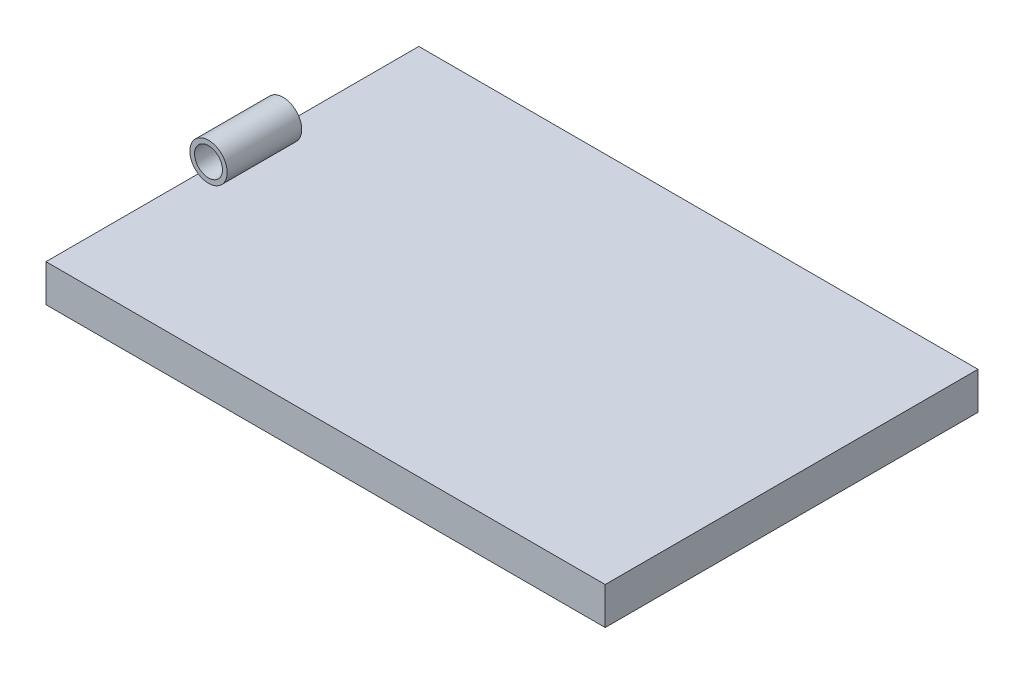
ISO-10303-21;
HEADER;
FILE_DESCRIPTION(('STEP AP214'),'2;1');
FILE_NAME('part.step','',(''),(''),'','','');
FILE_SCHEMA(('AUTOMOTIVE_DESIGN { 1 0 10303 214 1 1 1 1 }'));
ENDSEC;
DATA;
#1=APPLICATION_CONTEXT('core data for automotive mechanical design processes');
#2=APPLICATION_PROTOCOL_DEFINITION('international standard','automotive_design',2000,#1);
#3=PRODUCT_CONTEXT('',#1,'mechanical');
#4=PRODUCT('Part','Part','',(#3));
#5=PRODUCT_RELATED_PRODUCT_CATEGORY('part','',(#4));
#6=PRODUCT_DEFINITION_FORMATION('','',#4);
#7=PRODUCT_DEFINITION_CONTEXT('part definition',#1,'design');
#8=PRODUCT_DEFINITION('design','',#6,#7);
#9=PRODUCT_DEFINITION_SHAPE('','',#8);
#10=(LENGTH_UNIT() NAMED_UNIT(*) SI_UNIT(.MILLI.,.METRE.));
#11=(NAMED_UNIT(*) PLANE_ANGLE_UNIT() SI_UNIT($,.RADIAN.));
#12=(NAMED_UNIT(*) SI_UNIT($,.STERADIAN.) SOLID_ANGLE_UNIT());
#13=UNCERTAINTY_MEASURE_WITH_UNIT(LENGTH_MEASURE(1.E-05),#10,'distance_accuracy_value','');
#14=(GEOMETRIC_REPRESENTATION_CONTEXT(3) GLOBAL_UNCERTAINTY_ASSIGNED_CONTEXT((#13)) GLOBAL_UNIT_ASSIGNED_CONTEXT((#10,
#11,#12)) REPRESENTATION_CONTEXT('',''));
#15=CARTESIAN_POINT('',(0.,0.,0.));
#16=DIRECTION('',(0.,0.,1.));
#17=DIRECTION('',(1.,0.,0.));
#18=AXIS2_PLACEMENT_3D('',#15,#16,#17);
#19=CARTESIAN_POINT('',(1.82538706777381,7.62,-30.48));
#20=DIRECTION('',(0.,0.,1.));
#21=DIRECTION('',(1.,0.,0.));
#22=AXIS2_PLACEMENT_3D('',#19,#20,#21);
#23=CYLINDRICAL_SURFACE('',#22,2.54);
#24=CARTESIAN_POINT('',(1.82538706777381,7.62,-30.48));
#25=DIRECTION('',(0.,0.,1.));
#26=DIRECTION('',(1.,0.,0.));
#27=AXIS2_PLACEMENT_3D('',#24,#25,#26);
#28=CIRCLE('',#27,2.54);
#29=CARTESIAN_POINT('',(4.36538706777381,7.62,-30.48));
#30=VERTEX_POINT('',#29);
#31=EDGE_CURVE('E12',#30,#30,#28,.T.);
#32=ORIENTED_EDGE('',*,*,#31,.T.);
#33=EDGE_LOOP('',(#32));
#34=FACE_BOUND('',#33,.T.);
#35=CARTESIAN_POINT('',(1.82538706777381,7.62,-20.32));
#36=DIRECTION('',(0.,0.,1.));
#37=DIRECTION('',(1.,0.,0.));
#38=AXIS2_PLACEMENT_3D('',#35,#36,#37);
#39=CIRCLE('',#38,2.54);
#40=CARTESIAN_POINT('',(4.36538706777381,7.62,-20.32));
#41=VERTEX_POINT('',#40);
#42=EDGE_CURVE('E63',#41,#41,#39,.T.);
#43=ORIENTED_EDGE('',*,*,#42,.F.);
#44=EDGE_LOOP('',(#43));
#45=FACE_BOUND('',#44,.T.);
#46=ADVANCED_FACE('F53',(#34,#45),#23,.T.);
#47=CARTESIAN_POINT('',(1.82538706777381,7.62,-30.48));
#48=DIRECTION('',(0.,0.,1.));
#49=DIRECTION('',(1.,0.,0.));
#50=AXIS2_PLACEMENT_3D('',#47,#48,#49);
#51=PLANE('',#50);
#52=CARTESIAN_POINT('',(1.82538706777381,7.62,-30.48));
#53=DIRECTION('',(0.,0.,1.));
#54=DIRECTION('',(1.,0.,0.));
#55=AXIS2_PLACEMENT_3D('',#52,#53,#54);
#56=CIRCLE('',#55,1.905);
#57=CARTESIAN_POINT('',(3.7303870677738,7.62,-30.48));
#58=VERTEX_POINT('',#57);
#59=EDGE_CURVE('E59',#58,#58,#56,.T.);
#60=ORIENTED_EDGE('',*,*,#59,.T.);
#61=EDGE_LOOP('',(#60));
#62=FACE_BOUND('',#61,.T.);
#63=ORIENTED_EDGE('',*,*,#31,.F.);
#64=EDGE_LOOP('',(#63));
#65=FACE_BOUND('',#64,.T.);
#66=ADVANCED_FACE('F82',(#62,#65),#51,.F.);
#67=CARTESIAN_POINT('',(1.82538706777381,7.62,-30.48));
#68=DIRECTION('',(0.,0.,1.));
#69=DIRECTION('',(1.,0.,0.));
#70=AXIS2_PLACEMENT_3D('',#67,#68,#69);
#71=CYLINDRICAL_SURFACE('',#70,1.905);
#72=ORIENTED_EDGE('',*,*,#59,.F.);
#73=EDGE_LOOP('',(#72));
#74=FACE_BOUND('',#73,.T.);
#75=CARTESIAN_POINT('',(1.82538706777381,7.62,-20.32));
#76=DIRECTION('',(0.,0.,1.));
#77=DIRECTION('',(1.,0.,0.));
#78=AXIS2_PLACEMENT_3D('',#75,#76,#77);
#79=CIRCLE('',#78,1.905);
#80=CARTESIAN_POINT('',(3.7303870677738,7.62,-20.32));
#81=VERTEX_POINT('',#80);
#82=EDGE_CURVE('E67',#81,#81,#79,.T.);
#83=ORIENTED_EDGE('',*,*,#82,.T.);
#84=EDGE_LOOP('',(#83));
#85=FACE_BOUND('',#84,.T.);
#86=ADVANCED_FACE('F73',(#74,#85),#71,.F.);
#87=CARTESIAN_POINT('',(1.82538706777381,7.62,-20.32));
#88=DIRECTION('',(0.,0.,1.));
#89=DIRECTION('',(1.,0.,0.));
#90=AXIS2_PLACEMENT_3D('',#87,#88,#89);
#91=PLANE('',#90);
#92=ORIENTED_EDGE('',*,*,#42,.T.);
#93=EDGE_LOOP('',(#92));
#94=FACE_BOUND('',#93,.T.);
#95=ORIENTED_EDGE('',*,*,#82,.F.);
#96=EDGE_LOOP('',(#95));
#97=FACE_BOUND('',#96,.T.);
#98=ADVANCED_FACE('F75',(#94,#97),#91,.T.);
#99=CLOSED_SHELL('',(#46,#66,#86,#98));
#100=MANIFOLD_SOLID_BREP('B2',#99);
#101=CARTESIAN_POINT('',(0.,5.08,0.));
#102=DIRECTION('',(1.,0.,0.));
#103=DIRECTION('',(0.,0.,-1.));
#104=AXIS2_PLACEMENT_3D('',#101,#102,#103);
#105=PLANE('',#104);
#106=DIRECTION('',(0.,0.,1.));
#107=VECTOR('',#106,1.);
#108=CARTESIAN_POINT('',(0.,0.,0.));
#109=LINE('',#108,#107);
#110=CARTESIAN_POINT('',(0.,0.,-50.8));
#111=VERTEX_POINT('',#110);
#112=CARTESIAN_POINT('',(0.,0.,0.));
#113=VERTEX_POINT('',#112);
#114=EDGE_CURVE('E177',#111,#113,#109,.T.);
#115=ORIENTED_EDGE('',*,*,#114,.T.);
#116=DIRECTION('',(0.,-1.,0.));
#117=VECTOR('',#116,1.);
#118=CARTESIAN_POINT('',(0.,5.08,0.));
#119=LINE('',#118,#117);
#120=CARTESIAN_POINT('',(0.,5.08,0.));
#121=VERTEX_POINT('',#120);
#122=EDGE_CURVE('E51',#121,#113,#119,.T.);
#123=ORIENTED_EDGE('',*,*,#122,.F.);
#124=DIRECTION('',(0.,0.,1.));
#125=VECTOR('',#124,1.);
#126=CARTESIAN_POINT('',(0.,5.08,0.));
#127=LINE('',#126,#125);
#128=CARTESIAN_POINT('',(0.,5.08,-50.8));
#129=VERTEX_POINT('',#128);
#130=EDGE_CURVE('E165',#129,#121,#127,.T.);
#131=ORIENTED_EDGE('',*,*,#130,.F.);
#132=DIRECTION('',(0.,-1.,0.));
#133=VECTOR('',#132,1.);
#134=CARTESIAN_POINT('',(0.,5.08,-50.8));
#135=LINE('',#134,#133);
#136=EDGE_CURVE('E173',#129,#111,#135,.T.);
#137=ORIENTED_EDGE('',*,*,#136,.T.);
#138=EDGE_LOOP('',(#115,#123,#131,#137));
#139=FACE_BOUND('',#138,.T.);
#140=ADVANCED_FACE('F114',(#139),#105,.F.);
#141=CARTESIAN_POINT('',(0.,5.08,0.));
#142=DIRECTION('',(0.,0.,-1.));
#143=DIRECTION('',(-1.,0.,0.));
#144=AXIS2_PLACEMENT_3D('',#141,#142,#143);
#145=PLANE('',#144);
#146=DIRECTION('',(1.,0.,0.));
#147=VECTOR('',#146,1.);
#148=CARTESIAN_POINT('',(0.,0.,0.));
#149=LINE('',#148,#147);
#150=CARTESIAN_POINT('',(76.2,0.,0.));
#151=VERTEX_POINT('',#150);
#152=EDGE_CURVE('E169',#113,#151,#149,.T.);
#153=ORIENTED_EDGE('',*,*,#152,.T.);
#154=DIRECTION('',(0.,-1.,0.));
#155=VECTOR('',#154,1.);
#156=CARTESIAN_POINT('',(76.2,5.08,0.));
#157=LINE('',#156,#155);
#158=CARTESIAN_POINT('',(76.2,5.08,0.));
#159=VERTEX_POINT('',#158);
#160=EDGE_CURVE('E122',#159,#151,#157,.T.);
#161=ORIENTED_EDGE('',*,*,#160,.F.);
#162=DIRECTION('',(1.,0.,0.));
#163=VECTOR('',#162,1.);
#164=CARTESIAN_POINT('',(0.,5.08,0.));
#165=LINE('',#164,#163);
#166=EDGE_CURVE('E160',#121,#159,#165,.T.);
#167=ORIENTED_EDGE('',*,*,#166,.F.);
#168=ORIENTED_EDGE('',*,*,#122,.T.);
#169=EDGE_LOOP('',(#153,#161,#167,#168));
#170=FACE_BOUND('',#169,.T.);
#171=ADVANCED_FACE('F168',(#170),#145,.F.);
#172=CARTESIAN_POINT('',(76.2,5.08,0.));
#173=DIRECTION('',(-1.,0.,0.));
#174=DIRECTION('',(0.,0.,1.));
#175=AXIS2_PLACEMENT_3D('',#172,#173,#174);
#176=PLANE('',#175);
#177=DIRECTION('',(0.,0.,-1.));
#178=VECTOR('',#177,1.);
#179=CARTESIAN_POINT('',(76.2,0.,0.));
#180=LINE('',#179,#178);
#181=CARTESIAN_POINT('',(76.2,0.,-50.8));
#182=VERTEX_POINT('',#181);
#183=EDGE_CURVE('E147',#151,#182,#180,.T.);
#184=ORIENTED_EDGE('',*,*,#183,.T.);
#185=DIRECTION('',(0.,-1.,0.));
#186=VECTOR('',#185,1.);
#187=CARTESIAN_POINT('',(76.2,5.08,-50.8));
#188=LINE('',#187,#186);
#189=CARTESIAN_POINT('',(76.2,5.08,-50.8));
#190=VERTEX_POINT('',#189);
#191=EDGE_CURVE('E170',#190,#182,#188,.T.);
#192=ORIENTED_EDGE('',*,*,#191,.F.);
#193=DIRECTION('',(0.,0.,-1.));
#194=VECTOR('',#193,1.);
#195=CARTESIAN_POINT('',(76.2,5.08,0.));
#196=LINE('',#195,#194);
#197=EDGE_CURVE('E163',#159,#190,#196,.T.);
#198=ORIENTED_EDGE('',*,*,#197,.F.);
#199=ORIENTED_EDGE('',*,*,#160,.T.);
#200=EDGE_LOOP('',(#184,#192,#198,#199));
#201=FACE_BOUND('',#200,.T.);
#202=ADVANCED_FACE('F171',(#201),#176,.F.);
#203=CARTESIAN_POINT('',(0.,5.08,-50.8));
#204=DIRECTION('',(0.,0.,1.));
#205=DIRECTION('',(1.,0.,0.));
#206=AXIS2_PLACEMENT_3D('',#203,#204,#205);
#207=PLANE('',#206);
#208=DIRECTION('',(-1.,0.,0.));
#209=VECTOR('',#208,1.);
#210=CARTESIAN_POINT('',(0.,0.,-50.8));
#211=LINE('',#210,#209);
#212=EDGE_CURVE('E153',#182,#111,#211,.T.);
#213=ORIENTED_EDGE('',*,*,#212,.T.);
#214=ORIENTED_EDGE('',*,*,#136,.F.);
#215=DIRECTION('',(-1.,0.,0.));
#216=VECTOR('',#215,1.);
#217=CARTESIAN_POINT('',(0.,5.08,-50.8));
#218=LINE('',#217,#216);
#219=EDGE_CURVE('E130',#190,#129,#218,.T.);
#220=ORIENTED_EDGE('',*,*,#219,.F.);
#221=ORIENTED_EDGE('',*,*,#191,.T.);
#222=EDGE_LOOP('',(#213,#214,#220,#221));
#223=FACE_BOUND('',#222,.T.);
#224=ADVANCED_FACE('F184',(#223),#207,.F.);
#225=CARTESIAN_POINT('',(0.,5.08,0.));
#226=DIRECTION('',(0.,-1.,0.));
#227=DIRECTION('',(0.,0.,-1.));
#228=AXIS2_PLACEMENT_3D('',#225,#226,#227);
#229=PLANE('',#228);
#230=ORIENTED_EDGE('',*,*,#130,.T.);
#231=ORIENTED_EDGE('',*,*,#166,.T.);
#232=ORIENTED_EDGE('',*,*,#197,.T.);
#233=ORIENTED_EDGE('',*,*,#219,.T.);
#234=EDGE_LOOP('',(#230,#231,#232,#233));
#235=FACE_BOUND('',#234,.T.);
#236=ADVANCED_FACE('F161',(#235),#229,.F.);
#237=CARTESIAN_POINT('',(0.,0.,0.));
#238=DIRECTION('',(0.,-1.,0.));
#239=DIRECTION('',(0.,0.,-1.));
#240=AXIS2_PLACEMENT_3D('',#237,#238,#239);
#241=PLANE('',#240);
#242=ORIENTED_EDGE('',*,*,#114,.F.);
#243=ORIENTED_EDGE('',*,*,#212,.F.);
#244=ORIENTED_EDGE('',*,*,#183,.F.);
#245=ORIENTED_EDGE('',*,*,#152,.F.);
#246=EDGE_LOOP('',(#242,#243,#244,#245));
#247=FACE_BOUND('',#246,.T.);
#248=ADVANCED_FACE('F187',(#247),#241,.T.);
#249=CLOSED_SHELL('',(#140,#171,#202,#224,#236,#248));
#250=MANIFOLD_SOLID_BREP('B7',#249);
#251=ADVANCED_BREP_SHAPE_REPRESENTATION('',(#18,#100,#250),#14);
#252=SHAPE_DEFINITION_REPRESENTATION(#9,#251);
ENDSEC;
END-ISO-10303-21;
